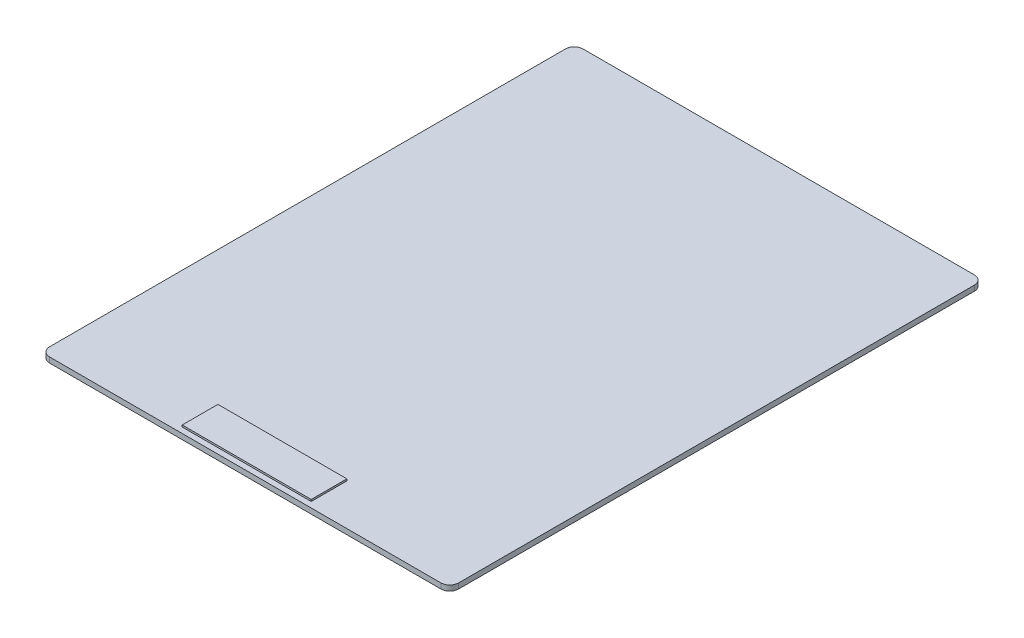
ISO-10303-21;
HEADER;
FILE_DESCRIPTION(('STEP AP214'),'2;1');
FILE_NAME('part.step','',(''),(''),'','','');
FILE_SCHEMA(('AUTOMOTIVE_DESIGN { 1 0 10303 214 1 1 1 1 }'));
ENDSEC;
DATA;
#1=APPLICATION_CONTEXT('core data for automotive mechanical design processes');
#2=APPLICATION_PROTOCOL_DEFINITION('international standard','automotive_design',2000,#1);
#3=PRODUCT_CONTEXT('',#1,'mechanical');
#4=PRODUCT('Part','Part','',(#3));
#5=PRODUCT_RELATED_PRODUCT_CATEGORY('part','',(#4));
#6=PRODUCT_DEFINITION_FORMATION('','',#4);
#7=PRODUCT_DEFINITION_CONTEXT('part definition',#1,'design');
#8=PRODUCT_DEFINITION('design','',#6,#7);
#9=PRODUCT_DEFINITION_SHAPE('','',#8);
#10=(LENGTH_UNIT() NAMED_UNIT(*) SI_UNIT(.MILLI.,.METRE.));
#11=(NAMED_UNIT(*) PLANE_ANGLE_UNIT() SI_UNIT($,.RADIAN.));
#12=(NAMED_UNIT(*) SI_UNIT($,.STERADIAN.) SOLID_ANGLE_UNIT());
#13=UNCERTAINTY_MEASURE_WITH_UNIT(LENGTH_MEASURE(1.E-05),#10,'distance_accuracy_value','');
#14=(GEOMETRIC_REPRESENTATION_CONTEXT(3) GLOBAL_UNCERTAINTY_ASSIGNED_CONTEXT((#13)) GLOBAL_UNIT_ASSIGNED_CONTEXT((#10,
#11,#12)) REPRESENTATION_CONTEXT('',''));
#15=CARTESIAN_POINT('',(0.,0.,0.));
#16=DIRECTION('',(0.,0.,1.));
#17=DIRECTION('',(1.,0.,0.));
#18=AXIS2_PLACEMENT_3D('',#15,#16,#17);
#19=CARTESIAN_POINT('',(0.,3.,0.));
#20=DIRECTION('',(0.,1.,0.));
#21=DIRECTION('',(0.,0.,1.));
#22=AXIS2_PLACEMENT_3D('',#19,#20,#21);
#23=PLANE('',#22);
#24=DIRECTION('',(1.,0.,0.));
#25=VECTOR('',#24,1.);
#26=CARTESIAN_POINT('',(554.297793406558,3.,-674.401400972109));
#27=LINE('',#26,#25);
#28=CARTESIAN_POINT('',(329.297793406558,3.,-674.401400972109));
#29=VERTEX_POINT('',#28);
#30=CARTESIAN_POINT('',(549.297793406558,3.,-674.401400972109));
#31=VERTEX_POINT('',#30);
#32=EDGE_CURVE('E167',#29,#31,#27,.T.);
#33=ORIENTED_EDGE('',*,*,#32,.T.);
#34=CARTESIAN_POINT('',(549.297793406558,3.,-679.401400972109));
#35=DIRECTION('',(0.,1.,0.));
#36=DIRECTION('',(0.,0.,1.));
#37=AXIS2_PLACEMENT_3D('',#34,#35,#36);
#38=CIRCLE('',#37,5.);
#39=CARTESIAN_POINT('',(554.297793406558,3.,-679.401400972109));
#40=VERTEX_POINT('',#39);
#41=EDGE_CURVE('E200',#31,#40,#38,.T.);
#42=ORIENTED_EDGE('',*,*,#41,.T.);
#43=DIRECTION('',(0.,0.,-1.));
#44=VECTOR('',#43,1.);
#45=CARTESIAN_POINT('',(554.297793406558,3.,-674.401400972109));
#46=LINE('',#45,#44);
#47=CARTESIAN_POINT('',(554.297793406558,3.,-969.401400972109));
#48=VERTEX_POINT('',#47);
#49=EDGE_CURVE('E158',#40,#48,#46,.T.);
#50=ORIENTED_EDGE('',*,*,#49,.T.);
#51=CARTESIAN_POINT('',(549.297793406558,3.,-969.401400972109));
#52=DIRECTION('',(0.,1.,0.));
#53=DIRECTION('',(0.,0.,1.));
#54=AXIS2_PLACEMENT_3D('',#51,#52,#53);
#55=CIRCLE('',#54,5.);
#56=CARTESIAN_POINT('',(549.297793406558,3.,-974.401400972109));
#57=VERTEX_POINT('',#56);
#58=EDGE_CURVE('E194',#48,#57,#55,.T.);
#59=ORIENTED_EDGE('',*,*,#58,.T.);
#60=DIRECTION('',(-1.,0.,0.));
#61=VECTOR('',#60,1.);
#62=CARTESIAN_POINT('',(554.297793406558,3.,-974.401400972109));
#63=LINE('',#62,#61);
#64=CARTESIAN_POINT('',(329.297793406558,3.,-974.401400972109));
#65=VERTEX_POINT('',#64);
#66=EDGE_CURVE('E161',#57,#65,#63,.T.);
#67=ORIENTED_EDGE('',*,*,#66,.T.);
#68=CARTESIAN_POINT('',(329.297793406558,3.,-969.401400972109));
#69=DIRECTION('',(0.,1.,0.));
#70=DIRECTION('',(0.,0.,1.));
#71=AXIS2_PLACEMENT_3D('',#68,#69,#70);
#72=CIRCLE('',#71,5.);
#73=CARTESIAN_POINT('',(324.297793406558,3.,-969.401400972109));
#74=VERTEX_POINT('',#73);
#75=EDGE_CURVE('E196',#65,#74,#72,.T.);
#76=ORIENTED_EDGE('',*,*,#75,.T.);
#77=DIRECTION('',(0.,0.,1.));
#78=VECTOR('',#77,1.);
#79=CARTESIAN_POINT('',(324.297793406558,3.,-674.401400972109));
#80=LINE('',#79,#78);
#81=CARTESIAN_POINT('',(324.297793406558,3.,-679.401400972109));
#82=VERTEX_POINT('',#81);
#83=EDGE_CURVE('E165',#74,#82,#80,.T.);
#84=ORIENTED_EDGE('',*,*,#83,.T.);
#85=CARTESIAN_POINT('',(329.297793406558,3.,-679.401400972109));
#86=DIRECTION('',(0.,1.,0.));
#87=DIRECTION('',(0.,0.,1.));
#88=AXIS2_PLACEMENT_3D('',#85,#86,#87);
#89=CIRCLE('',#88,5.);
#90=EDGE_CURVE('E198',#82,#29,#89,.T.);
#91=ORIENTED_EDGE('',*,*,#90,.T.);
#92=EDGE_LOOP('',(#33,#42,#50,#59,#67,#76,#84,#91));
#93=FACE_BOUND('',#92,.T.);
#94=DIRECTION('',(-1.,0.,0.));
#95=VECTOR('',#94,1.);
#96=CARTESIAN_POINT('',(473.214610510016,3.,-697.632220963118));
#97=LINE('',#96,#95);
#98=CARTESIAN_POINT('',(473.214610510016,3.,-697.632220963118));
#99=VERTEX_POINT('',#98);
#100=CARTESIAN_POINT('',(400.684460149899,3.,-697.632220963118));
#101=VERTEX_POINT('',#100);
#102=EDGE_CURVE('E336',#99,#101,#97,.T.);
#103=ORIENTED_EDGE('',*,*,#102,.F.);
#104=DIRECTION('',(0.,0.,-1.));
#105=VECTOR('',#104,1.);
#106=CARTESIAN_POINT('',(473.214610510016,3.,-677.558602325591));
#107=LINE('',#106,#105);
#108=CARTESIAN_POINT('',(473.214610510016,3.,-677.558602325591));
#109=VERTEX_POINT('',#108);
#110=EDGE_CURVE('E148',#109,#99,#107,.T.);
#111=ORIENTED_EDGE('',*,*,#110,.F.);
#112=DIRECTION('',(1.,0.,0.));
#113=VECTOR('',#112,1.);
#114=CARTESIAN_POINT('',(473.214610510016,3.,-677.558602325591));
#115=LINE('',#114,#113);
#116=CARTESIAN_POINT('',(400.684460149899,3.,-677.558602325591));
#117=VERTEX_POINT('',#116);
#118=EDGE_CURVE('E144',#117,#109,#115,.T.);
#119=ORIENTED_EDGE('',*,*,#118,.F.);
#120=DIRECTION('',(0.,0.,1.));
#121=VECTOR('',#120,1.);
#122=CARTESIAN_POINT('',(400.684460149899,3.,-677.558602325591));
#123=LINE('',#122,#121);
#124=EDGE_CURVE('E333',#101,#117,#123,.T.);
#125=ORIENTED_EDGE('',*,*,#124,.F.);
#126=EDGE_LOOP('',(#103,#111,#119,#125));
#127=FACE_BOUND('',#126,.T.);
#128=ADVANCED_FACE('F35',(#93,#127),#23,.T.);
#129=CARTESIAN_POINT('',(554.297793406558,3.,-674.401400972109));
#130=DIRECTION('',(-1.,0.,0.));
#131=DIRECTION('',(0.,0.,1.));
#132=AXIS2_PLACEMENT_3D('',#129,#130,#131);
#133=PLANE('',#132);
#134=ORIENTED_EDGE('',*,*,#49,.F.);
#135=DIRECTION('',(0.,-1.,0.));
#136=VECTOR('',#135,1.);
#137=CARTESIAN_POINT('',(554.297793406558,3.,-679.401400972109));
#138=LINE('',#137,#136);
#139=CARTESIAN_POINT('',(554.297793406558,0.,-679.401400972109));
#140=VERTEX_POINT('',#139);
#141=EDGE_CURVE('E178',#40,#140,#138,.T.);
#142=ORIENTED_EDGE('',*,*,#141,.T.);
#143=DIRECTION('',(0.,0.,-1.));
#144=VECTOR('',#143,1.);
#145=CARTESIAN_POINT('',(554.297793406558,0.,-674.401400972109));
#146=LINE('',#145,#144);
#147=CARTESIAN_POINT('',(554.297793406558,0.,-969.401400972109));
#148=VERTEX_POINT('',#147);
#149=EDGE_CURVE('E150',#140,#148,#146,.T.);
#150=ORIENTED_EDGE('',*,*,#149,.T.);
#151=DIRECTION('',(0.,-1.,0.));
#152=VECTOR('',#151,1.);
#153=CARTESIAN_POINT('',(554.297793406558,3.,-969.401400972109));
#154=LINE('',#153,#152);
#155=EDGE_CURVE('E169',#148,#48,#154,.F.);
#156=ORIENTED_EDGE('',*,*,#155,.T.);
#157=EDGE_LOOP('',(#134,#142,#150,#156));
#158=FACE_BOUND('',#157,.T.);
#159=ADVANCED_FACE('F240',(#158),#133,.F.);
#160=CARTESIAN_POINT('',(554.297793406558,3.,-974.401400972109));
#161=DIRECTION('',(0.,0.,1.));
#162=DIRECTION('',(1.,0.,0.));
#163=AXIS2_PLACEMENT_3D('',#160,#161,#162);
#164=PLANE('',#163);
#165=DIRECTION('',(-1.,0.,0.));
#166=VECTOR('',#165,1.);
#167=CARTESIAN_POINT('',(554.297793406558,0.,-974.401400972109));
#168=LINE('',#167,#166);
#169=CARTESIAN_POINT('',(549.297793406558,0.,-974.401400972109));
#170=VERTEX_POINT('',#169);
#171=CARTESIAN_POINT('',(329.297793406558,0.,-974.401400972109));
#172=VERTEX_POINT('',#171);
#173=EDGE_CURVE('E153',#170,#172,#168,.T.);
#174=ORIENTED_EDGE('',*,*,#173,.T.);
#175=DIRECTION('',(0.,-1.,0.));
#176=VECTOR('',#175,1.);
#177=CARTESIAN_POINT('',(329.297793406558,3.,-974.401400972109));
#178=LINE('',#177,#176);
#179=EDGE_CURVE('E11',#172,#65,#178,.F.);
#180=ORIENTED_EDGE('',*,*,#179,.T.);
#181=ORIENTED_EDGE('',*,*,#66,.F.);
#182=DIRECTION('',(0.,-1.,0.));
#183=VECTOR('',#182,1.);
#184=CARTESIAN_POINT('',(549.297793406558,3.,-974.401400972109));
#185=LINE('',#184,#183);
#186=EDGE_CURVE('E43',#57,#170,#185,.T.);
#187=ORIENTED_EDGE('',*,*,#186,.T.);
#188=EDGE_LOOP('',(#174,#180,#181,#187));
#189=FACE_BOUND('',#188,.T.);
#190=ADVANCED_FACE('F210',(#189),#164,.F.);
#191=CARTESIAN_POINT('',(324.297793406558,3.,-674.401400972109));
#192=DIRECTION('',(1.,0.,0.));
#193=DIRECTION('',(0.,0.,-1.));
#194=AXIS2_PLACEMENT_3D('',#191,#192,#193);
#195=PLANE('',#194);
#196=DIRECTION('',(0.,0.,1.));
#197=VECTOR('',#196,1.);
#198=CARTESIAN_POINT('',(324.297793406558,0.,-674.401400972109));
#199=LINE('',#198,#197);
#200=CARTESIAN_POINT('',(324.297793406558,0.,-969.401400972109));
#201=VERTEX_POINT('',#200);
#202=CARTESIAN_POINT('',(324.297793406558,0.,-679.401400972109));
#203=VERTEX_POINT('',#202);
#204=EDGE_CURVE('E173',#201,#203,#199,.T.);
#205=ORIENTED_EDGE('',*,*,#204,.T.);
#206=DIRECTION('',(0.,-1.,0.));
#207=VECTOR('',#206,1.);
#208=CARTESIAN_POINT('',(324.297793406558,3.,-679.401400972109));
#209=LINE('',#208,#207);
#210=EDGE_CURVE('E58',#203,#82,#209,.F.);
#211=ORIENTED_EDGE('',*,*,#210,.T.);
#212=ORIENTED_EDGE('',*,*,#83,.F.);
#213=DIRECTION('',(0.,-1.,0.));
#214=VECTOR('',#213,1.);
#215=CARTESIAN_POINT('',(324.297793406558,3.,-969.401400972109));
#216=LINE('',#215,#214);
#217=EDGE_CURVE('E202',#74,#201,#216,.T.);
#218=ORIENTED_EDGE('',*,*,#217,.T.);
#219=EDGE_LOOP('',(#205,#211,#212,#218));
#220=FACE_BOUND('',#219,.T.);
#221=ADVANCED_FACE('F222',(#220),#195,.F.);
#222=CARTESIAN_POINT('',(554.297793406558,3.,-674.401400972109));
#223=DIRECTION('',(0.,0.,-1.));
#224=DIRECTION('',(-1.,0.,0.));
#225=AXIS2_PLACEMENT_3D('',#222,#223,#224);
#226=PLANE('',#225);
#227=DIRECTION('',(1.,0.,0.));
#228=VECTOR('',#227,1.);
#229=CARTESIAN_POINT('',(554.297793406558,0.,-674.401400972109));
#230=LINE('',#229,#228);
#231=CARTESIAN_POINT('',(329.297793406558,0.,-674.401400972109));
#232=VERTEX_POINT('',#231);
#233=CARTESIAN_POINT('',(549.297793406558,0.,-674.401400972109));
#234=VERTEX_POINT('',#233);
#235=EDGE_CURVE('E162',#232,#234,#230,.T.);
#236=ORIENTED_EDGE('',*,*,#235,.T.);
#237=DIRECTION('',(0.,-1.,0.));
#238=VECTOR('',#237,1.);
#239=CARTESIAN_POINT('',(549.297793406558,3.,-674.401400972109));
#240=LINE('',#239,#238);
#241=EDGE_CURVE('E192',#234,#31,#240,.F.);
#242=ORIENTED_EDGE('',*,*,#241,.T.);
#243=ORIENTED_EDGE('',*,*,#32,.F.);
#244=DIRECTION('',(0.,-1.,0.));
#245=VECTOR('',#244,1.);
#246=CARTESIAN_POINT('',(329.297793406558,3.,-674.401400972109));
#247=LINE('',#246,#245);
#248=EDGE_CURVE('E189',#29,#232,#247,.T.);
#249=ORIENTED_EDGE('',*,*,#248,.T.);
#250=EDGE_LOOP('',(#236,#242,#243,#249));
#251=FACE_BOUND('',#250,.T.);
#252=ADVANCED_FACE('F232',(#251),#226,.F.);
#253=CARTESIAN_POINT('',(0.,0.,0.));
#254=DIRECTION('',(0.,1.,0.));
#255=DIRECTION('',(0.,0.,1.));
#256=AXIS2_PLACEMENT_3D('',#253,#254,#255);
#257=PLANE('',#256);
#258=ORIENTED_EDGE('',*,*,#149,.F.);
#259=CARTESIAN_POINT('',(549.297793406558,0.,-679.401400972109));
#260=DIRECTION('',(0.,1.,0.));
#261=DIRECTION('',(0.,0.,1.));
#262=AXIS2_PLACEMENT_3D('',#259,#260,#261);
#263=CIRCLE('',#262,5.);
#264=EDGE_CURVE('E187',#140,#234,#263,.F.);
#265=ORIENTED_EDGE('',*,*,#264,.T.);
#266=ORIENTED_EDGE('',*,*,#235,.F.);
#267=CARTESIAN_POINT('',(329.297793406558,0.,-679.401400972109));
#268=DIRECTION('',(0.,1.,0.));
#269=DIRECTION('',(0.,0.,1.));
#270=AXIS2_PLACEMENT_3D('',#267,#268,#269);
#271=CIRCLE('',#270,5.);
#272=EDGE_CURVE('E185',#232,#203,#271,.F.);
#273=ORIENTED_EDGE('',*,*,#272,.T.);
#274=ORIENTED_EDGE('',*,*,#204,.F.);
#275=CARTESIAN_POINT('',(329.297793406558,0.,-969.401400972109));
#276=DIRECTION('',(0.,1.,0.));
#277=DIRECTION('',(0.,0.,1.));
#278=AXIS2_PLACEMENT_3D('',#275,#276,#277);
#279=CIRCLE('',#278,5.);
#280=EDGE_CURVE('E183',#201,#172,#279,.F.);
#281=ORIENTED_EDGE('',*,*,#280,.T.);
#282=ORIENTED_EDGE('',*,*,#173,.F.);
#283=CARTESIAN_POINT('',(549.297793406558,0.,-969.401400972109));
#284=DIRECTION('',(0.,1.,0.));
#285=DIRECTION('',(0.,0.,1.));
#286=AXIS2_PLACEMENT_3D('',#283,#284,#285);
#287=CIRCLE('',#286,5.);
#288=EDGE_CURVE('E181',#170,#148,#287,.F.);
#289=ORIENTED_EDGE('',*,*,#288,.T.);
#290=EDGE_LOOP('',(#258,#265,#266,#273,#274,#281,#282,#289));
#291=FACE_BOUND('',#290,.T.);
#292=ADVANCED_FACE('F216',(#291),#257,.F.);
#293=CARTESIAN_POINT('',(549.297793406558,3.,-679.401400972109));
#294=DIRECTION('',(0.,-1.,0.));
#295=DIRECTION('',(0.,0.,-1.));
#296=AXIS2_PLACEMENT_3D('',#293,#294,#295);
#297=CYLINDRICAL_SURFACE('',#296,5.);
#298=ORIENTED_EDGE('',*,*,#41,.F.);
#299=ORIENTED_EDGE('',*,*,#241,.F.);
#300=ORIENTED_EDGE('',*,*,#264,.F.);
#301=ORIENTED_EDGE('',*,*,#141,.F.);
#302=EDGE_LOOP('',(#298,#299,#300,#301));
#303=FACE_BOUND('',#302,.T.);
#304=ADVANCED_FACE('F237',(#303),#297,.T.);
#305=CARTESIAN_POINT('',(329.297793406558,3.,-679.401400972109));
#306=DIRECTION('',(0.,-1.,0.));
#307=DIRECTION('',(0.,0.,-1.));
#308=AXIS2_PLACEMENT_3D('',#305,#306,#307);
#309=CYLINDRICAL_SURFACE('',#308,5.);
#310=ORIENTED_EDGE('',*,*,#90,.F.);
#311=ORIENTED_EDGE('',*,*,#210,.F.);
#312=ORIENTED_EDGE('',*,*,#272,.F.);
#313=ORIENTED_EDGE('',*,*,#248,.F.);
#314=EDGE_LOOP('',(#310,#311,#312,#313));
#315=FACE_BOUND('',#314,.T.);
#316=ADVANCED_FACE('F229',(#315),#309,.T.);
#317=CARTESIAN_POINT('',(329.297793406558,3.,-969.401400972109));
#318=DIRECTION('',(0.,-1.,0.));
#319=DIRECTION('',(0.,0.,-1.));
#320=AXIS2_PLACEMENT_3D('',#317,#318,#319);
#321=CYLINDRICAL_SURFACE('',#320,5.);
#322=ORIENTED_EDGE('',*,*,#75,.F.);
#323=ORIENTED_EDGE('',*,*,#179,.F.);
#324=ORIENTED_EDGE('',*,*,#280,.F.);
#325=ORIENTED_EDGE('',*,*,#217,.F.);
#326=EDGE_LOOP('',(#322,#323,#324,#325));
#327=FACE_BOUND('',#326,.T.);
#328=ADVANCED_FACE('F221',(#327),#321,.T.);
#329=CARTESIAN_POINT('',(549.297793406558,3.,-969.401400972109));
#330=DIRECTION('',(0.,-1.,0.));
#331=DIRECTION('',(0.,0.,-1.));
#332=AXIS2_PLACEMENT_3D('',#329,#330,#331);
#333=CYLINDRICAL_SURFACE('',#332,5.);
#334=ORIENTED_EDGE('',*,*,#58,.F.);
#335=ORIENTED_EDGE('',*,*,#155,.F.);
#336=ORIENTED_EDGE('',*,*,#288,.F.);
#337=ORIENTED_EDGE('',*,*,#186,.F.);
#338=EDGE_LOOP('',(#334,#335,#336,#337));
#339=FACE_BOUND('',#338,.T.);
#340=ADVANCED_FACE('F37',(#339),#333,.T.);
#341=CARTESIAN_POINT('',(473.214610510016,4.,-677.558602325591));
#342=DIRECTION('',(-1.,0.,0.));
#343=DIRECTION('',(0.,0.,1.));
#344=AXIS2_PLACEMENT_3D('',#341,#342,#343);
#345=PLANE('',#344);
#346=ORIENTED_EDGE('',*,*,#110,.T.);
#347=DIRECTION('',(0.,-1.,0.));
#348=VECTOR('',#347,1.);
#349=CARTESIAN_POINT('',(473.214610510016,4.,-697.632220963118));
#350=LINE('',#349,#348);
#351=CARTESIAN_POINT('',(473.214610510016,4.,-697.632220963118));
#352=VERTEX_POINT('',#351);
#353=EDGE_CURVE('E129',#352,#99,#350,.T.);
#354=ORIENTED_EDGE('',*,*,#353,.F.);
#355=DIRECTION('',(0.,0.,-1.));
#356=VECTOR('',#355,1.);
#357=CARTESIAN_POINT('',(473.214610510016,4.,-677.558602325591));
#358=LINE('',#357,#356);
#359=CARTESIAN_POINT('',(473.214610510016,4.,-677.558602325591));
#360=VERTEX_POINT('',#359);
#361=EDGE_CURVE('E136',#360,#352,#358,.T.);
#362=ORIENTED_EDGE('',*,*,#361,.F.);
#363=DIRECTION('',(0.,-1.,0.));
#364=VECTOR('',#363,1.);
#365=CARTESIAN_POINT('',(473.214610510016,4.,-677.558602325591));
#366=LINE('',#365,#364);
#367=EDGE_CURVE('E331',#360,#109,#366,.T.);
#368=ORIENTED_EDGE('',*,*,#367,.T.);
#369=EDGE_LOOP('',(#346,#354,#362,#368));
#370=FACE_BOUND('',#369,.T.);
#371=ADVANCED_FACE('F146',(#370),#345,.F.);
#372=CARTESIAN_POINT('',(473.214610510016,4.,-697.632220963118));
#373=DIRECTION('',(0.,0.,1.));
#374=DIRECTION('',(1.,0.,0.));
#375=AXIS2_PLACEMENT_3D('',#372,#373,#374);
#376=PLANE('',#375);
#377=ORIENTED_EDGE('',*,*,#102,.T.);
#378=DIRECTION('',(0.,-1.,0.));
#379=VECTOR('',#378,1.);
#380=CARTESIAN_POINT('',(400.684460149899,4.,-697.632220963118));
#381=LINE('',#380,#379);
#382=CARTESIAN_POINT('',(400.684460149899,4.,-697.632220963118));
#383=VERTEX_POINT('',#382);
#384=EDGE_CURVE('E132',#383,#101,#381,.T.);
#385=ORIENTED_EDGE('',*,*,#384,.F.);
#386=DIRECTION('',(-1.,0.,0.));
#387=VECTOR('',#386,1.);
#388=CARTESIAN_POINT('',(473.214610510016,4.,-697.632220963118));
#389=LINE('',#388,#387);
#390=EDGE_CURVE('E125',#352,#383,#389,.T.);
#391=ORIENTED_EDGE('',*,*,#390,.F.);
#392=ORIENTED_EDGE('',*,*,#353,.T.);
#393=EDGE_LOOP('',(#377,#385,#391,#392));
#394=FACE_BOUND('',#393,.T.);
#395=ADVANCED_FACE('F127',(#394),#376,.F.);
#396=CARTESIAN_POINT('',(400.684460149899,4.,-677.558602325591));
#397=DIRECTION('',(1.,0.,0.));
#398=DIRECTION('',(0.,0.,-1.));
#399=AXIS2_PLACEMENT_3D('',#396,#397,#398);
#400=PLANE('',#399);
#401=ORIENTED_EDGE('',*,*,#124,.T.);
#402=DIRECTION('',(0.,-1.,0.));
#403=VECTOR('',#402,1.);
#404=CARTESIAN_POINT('',(400.684460149899,4.,-677.558602325591));
#405=LINE('',#404,#403);
#406=CARTESIAN_POINT('',(400.684460149899,4.,-677.558602325591));
#407=VERTEX_POINT('',#406);
#408=EDGE_CURVE('E50',#407,#117,#405,.T.);
#409=ORIENTED_EDGE('',*,*,#408,.F.);
#410=DIRECTION('',(0.,0.,1.));
#411=VECTOR('',#410,1.);
#412=CARTESIAN_POINT('',(400.684460149899,4.,-677.558602325591));
#413=LINE('',#412,#411);
#414=EDGE_CURVE('E135',#383,#407,#413,.T.);
#415=ORIENTED_EDGE('',*,*,#414,.F.);
#416=ORIENTED_EDGE('',*,*,#384,.T.);
#417=EDGE_LOOP('',(#401,#409,#415,#416));
#418=FACE_BOUND('',#417,.T.);
#419=ADVANCED_FACE('F299',(#418),#400,.F.);
#420=CARTESIAN_POINT('',(473.214610510016,4.,-677.558602325591));
#421=DIRECTION('',(0.,0.,-1.));
#422=DIRECTION('',(-1.,0.,0.));
#423=AXIS2_PLACEMENT_3D('',#420,#421,#422);
#424=PLANE('',#423);
#425=ORIENTED_EDGE('',*,*,#118,.T.);
#426=ORIENTED_EDGE('',*,*,#367,.F.);
#427=DIRECTION('',(1.,0.,0.));
#428=VECTOR('',#427,1.);
#429=CARTESIAN_POINT('',(473.214610510016,4.,-677.558602325591));
#430=LINE('',#429,#428);
#431=EDGE_CURVE('E140',#407,#360,#430,.T.);
#432=ORIENTED_EDGE('',*,*,#431,.F.);
#433=ORIENTED_EDGE('',*,*,#408,.T.);
#434=EDGE_LOOP('',(#425,#426,#432,#433));
#435=FACE_BOUND('',#434,.T.);
#436=ADVANCED_FACE('F306',(#435),#424,.F.);
#437=CARTESIAN_POINT('',(0.,4.,0.));
#438=DIRECTION('',(0.,1.,0.));
#439=DIRECTION('',(0.,0.,1.));
#440=AXIS2_PLACEMENT_3D('',#437,#438,#439);
#441=PLANE('',#440);
#442=ORIENTED_EDGE('',*,*,#361,.T.);
#443=ORIENTED_EDGE('',*,*,#390,.T.);
#444=ORIENTED_EDGE('',*,*,#414,.T.);
#445=ORIENTED_EDGE('',*,*,#431,.T.);
#446=EDGE_LOOP('',(#442,#443,#444,#445));
#447=FACE_BOUND('',#446,.T.);
#448=ADVANCED_FACE('F139',(#447),#441,.T.);
#449=CLOSED_SHELL('',(#128,#159,#190,#221,#252,#292,#304,#316,#328,#340,#371,#395,#419,#436,#448));
#450=MANIFOLD_SOLID_BREP('B2',#449);
#451=ADVANCED_BREP_SHAPE_REPRESENTATION('',(#18,#450),#14);
#452=SHAPE_DEFINITION_REPRESENTATION(#9,#451);
ENDSEC;
END-ISO-10303-21;
